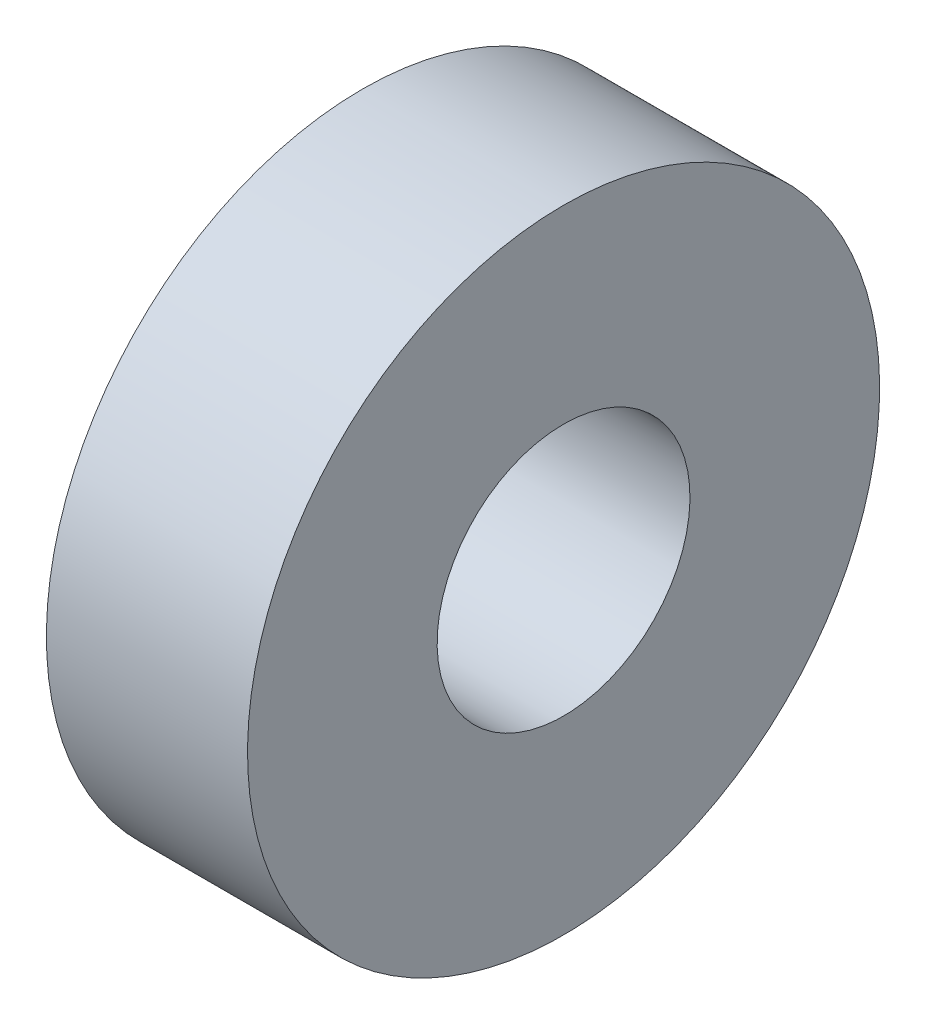
ISO-10303-21;
HEADER;
FILE_DESCRIPTION(('STEP AP214'),'2;1');
FILE_NAME('part.step','',(''),(''),'','','');
FILE_SCHEMA(('AUTOMOTIVE_DESIGN { 1 0 10303 214 1 1 1 1 }'));
ENDSEC;
DATA;
#1=APPLICATION_CONTEXT('core data for automotive mechanical design processes');
#2=APPLICATION_PROTOCOL_DEFINITION('international standard','automotive_design',2000,#1);
#3=PRODUCT_CONTEXT('',#1,'mechanical');
#4=PRODUCT('Part','Part','',(#3));
#5=PRODUCT_RELATED_PRODUCT_CATEGORY('part','',(#4));
#6=PRODUCT_DEFINITION_FORMATION('','',#4);
#7=PRODUCT_DEFINITION_CONTEXT('part definition',#1,'design');
#8=PRODUCT_DEFINITION('design','',#6,#7);
#9=PRODUCT_DEFINITION_SHAPE('','',#8);
#10=(LENGTH_UNIT() NAMED_UNIT(*) SI_UNIT(.MILLI.,.METRE.));
#11=(NAMED_UNIT(*) PLANE_ANGLE_UNIT() SI_UNIT($,.RADIAN.));
#12=(NAMED_UNIT(*) SI_UNIT($,.STERADIAN.) SOLID_ANGLE_UNIT());
#13=UNCERTAINTY_MEASURE_WITH_UNIT(LENGTH_MEASURE(1.E-05),#10,'distance_accuracy_value','');
#14=(GEOMETRIC_REPRESENTATION_CONTEXT(3) GLOBAL_UNCERTAINTY_ASSIGNED_CONTEXT((#13)) GLOBAL_UNIT_ASSIGNED_CONTEXT((#10,
#11,#12)) REPRESENTATION_CONTEXT('',''));
#15=CARTESIAN_POINT('',(0.,0.,0.));
#16=DIRECTION('',(0.,0.,1.));
#17=DIRECTION('',(1.,0.,0.));
#18=AXIS2_PLACEMENT_3D('',#15,#16,#17);
#19=CARTESIAN_POINT('',(0.,0.,0.));
#20=DIRECTION('',(-1.,0.,0.));
#21=DIRECTION('',(0.,0.,1.));
#22=AXIS2_PLACEMENT_3D('',#19,#20,#21);
#23=CYLINDRICAL_SURFACE('',#22,220.);
#24=CARTESIAN_POINT('',(900.,0.,0.));
#25=DIRECTION('',(-1.,0.,0.));
#26=DIRECTION('',(0.,0.,1.));
#27=AXIS2_PLACEMENT_3D('',#24,#25,#26);
#28=CIRCLE('',#27,220.);
#29=CARTESIAN_POINT('',(900.,220.,-1.57950893313031E-06));
#30=VERTEX_POINT('',#29);
#31=CARTESIAN_POINT('',(900.,220.,0.));
#32=VERTEX_POINT('',#31);
#33=EDGE_CURVE('E11',#30,#32,#28,.T.);
#34=ORIENTED_EDGE('',*,*,#33,.T.);
#35=DIRECTION('',(1.,0.,0.));
#36=VECTOR('',#35,1.);
#37=CARTESIAN_POINT('',(1250.,220.,0.));
#38=LINE('',#37,#36);
#39=CARTESIAN_POINT('',(1250.,220.,0.));
#40=VERTEX_POINT('',#39);
#41=EDGE_CURVE('E100',#32,#40,#38,.T.);
#42=ORIENTED_EDGE('',*,*,#41,.T.);
#43=CARTESIAN_POINT('',(1250.,0.,0.));
#44=DIRECTION('',(-1.,0.,0.));
#45=DIRECTION('',(0.,0.,1.));
#46=AXIS2_PLACEMENT_3D('',#43,#44,#45);
#47=CIRCLE('',#46,220.);
#48=CARTESIAN_POINT('',(1250.,220.,-1.57950893313031E-06));
#49=VERTEX_POINT('',#48);
#50=EDGE_CURVE('E80',#49,#40,#47,.T.);
#51=ORIENTED_EDGE('',*,*,#50,.F.);
#52=DIRECTION('',(1.,0.,0.));
#53=VECTOR('',#52,1.);
#54=CARTESIAN_POINT('',(1250.,220.,-1.57950893313031E-06));
#55=LINE('',#54,#53);
#56=EDGE_CURVE('E103',#30,#49,#55,.T.);
#57=ORIENTED_EDGE('',*,*,#56,.F.);
#58=EDGE_LOOP('',(#34,#42,#51,#57));
#59=FACE_BOUND('',#58,.T.);
#60=ADVANCED_FACE('F39',(#59),#23,.F.);
#61=CARTESIAN_POINT('',(900.,220.,-1.57950893313031E-06));
#62=DIRECTION('',(1.,0.,0.));
#63=DIRECTION('',(0.,0.,-1.));
#64=AXIS2_PLACEMENT_3D('',#61,#62,#63);
#65=PLANE('',#64);
#66=CARTESIAN_POINT('',(900.,0.,0.));
#67=DIRECTION('',(-1.,0.,0.));
#68=DIRECTION('',(0.,0.,1.));
#69=AXIS2_PLACEMENT_3D('',#66,#67,#68);
#70=CIRCLE('',#69,550.);
#71=CARTESIAN_POINT('',(900.,550.,-3.94877233282577E-06));
#72=VERTEX_POINT('',#71);
#73=CARTESIAN_POINT('',(900.,550.,0.));
#74=VERTEX_POINT('',#73);
#75=EDGE_CURVE('E50',#72,#74,#70,.T.);
#76=ORIENTED_EDGE('',*,*,#75,.T.);
#77=DIRECTION('',(0.,-1.,0.));
#78=VECTOR('',#77,1.);
#79=CARTESIAN_POINT('',(900.,220.,0.));
#80=LINE('',#79,#78);
#81=EDGE_CURVE('E104',#74,#32,#80,.T.);
#82=ORIENTED_EDGE('',*,*,#81,.T.);
#83=ORIENTED_EDGE('',*,*,#33,.F.);
#84=DIRECTION('',(0.,-1.,7.17958605968322E-09));
#85=VECTOR('',#84,1.);
#86=CARTESIAN_POINT('',(900.,220.,-1.57950893313031E-06));
#87=LINE('',#86,#85);
#88=EDGE_CURVE('E91',#72,#30,#87,.T.);
#89=ORIENTED_EDGE('',*,*,#88,.F.);
#90=EDGE_LOOP('',(#76,#82,#83,#89));
#91=FACE_BOUND('',#90,.T.);
#92=ADVANCED_FACE('F41',(#91),#65,.F.);
#93=CARTESIAN_POINT('',(0.,0.,0.));
#94=DIRECTION('',(-1.,0.,0.));
#95=DIRECTION('',(0.,0.,1.));
#96=AXIS2_PLACEMENT_3D('',#93,#94,#95);
#97=CYLINDRICAL_SURFACE('',#96,550.);
#98=CARTESIAN_POINT('',(1250.,0.,0.));
#99=DIRECTION('',(-1.,0.,0.));
#100=DIRECTION('',(0.,0.,1.));
#101=AXIS2_PLACEMENT_3D('',#98,#99,#100);
#102=CIRCLE('',#101,550.);
#103=CARTESIAN_POINT('',(1250.,550.,-3.94877233282577E-06));
#104=VERTEX_POINT('',#103);
#105=CARTESIAN_POINT('',(1250.,550.,0.));
#106=VERTEX_POINT('',#105);
#107=EDGE_CURVE('E89',#104,#106,#102,.T.);
#108=ORIENTED_EDGE('',*,*,#107,.T.);
#109=DIRECTION('',(-1.,0.,0.));
#110=VECTOR('',#109,1.);
#111=CARTESIAN_POINT('',(900.,550.,0.));
#112=LINE('',#111,#110);
#113=EDGE_CURVE('E97',#106,#74,#112,.T.);
#114=ORIENTED_EDGE('',*,*,#113,.T.);
#115=ORIENTED_EDGE('',*,*,#75,.F.);
#116=DIRECTION('',(-1.,0.,0.));
#117=VECTOR('',#116,1.);
#118=CARTESIAN_POINT('',(900.,550.,-3.94877233282577E-06));
#119=LINE('',#118,#117);
#120=EDGE_CURVE('E109',#104,#72,#119,.T.);
#121=ORIENTED_EDGE('',*,*,#120,.F.);
#122=EDGE_LOOP('',(#108,#114,#115,#121));
#123=FACE_BOUND('',#122,.T.);
#124=ADVANCED_FACE('F112',(#123),#97,.T.);
#125=CARTESIAN_POINT('',(1250.,550.,-3.94877233282577E-06));
#126=DIRECTION('',(-1.,0.,0.));
#127=DIRECTION('',(0.,0.,1.));
#128=AXIS2_PLACEMENT_3D('',#125,#126,#127);
#129=PLANE('',#128);
#130=DIRECTION('',(0.,1.,-7.17958605968322E-09));
#131=VECTOR('',#130,1.);
#132=CARTESIAN_POINT('',(1250.,550.,-3.94877233282577E-06));
#133=LINE('',#132,#131);
#134=EDGE_CURVE('E82',#49,#104,#133,.T.);
#135=ORIENTED_EDGE('',*,*,#134,.F.);
#136=ORIENTED_EDGE('',*,*,#50,.T.);
#137=DIRECTION('',(0.,1.,0.));
#138=VECTOR('',#137,1.);
#139=CARTESIAN_POINT('',(1250.,550.,0.));
#140=LINE('',#139,#138);
#141=EDGE_CURVE('E85',#40,#106,#140,.T.);
#142=ORIENTED_EDGE('',*,*,#141,.T.);
#143=ORIENTED_EDGE('',*,*,#107,.F.);
#144=EDGE_LOOP('',(#135,#136,#142,#143));
#145=FACE_BOUND('',#144,.T.);
#146=ADVANCED_FACE('F83',(#145),#129,.F.);
#147=CARTESIAN_POINT('',(0.,0.,0.));
#148=DIRECTION('',(0.,-7.17958605968322E-09,-1.));
#149=DIRECTION('',(-1.,0.,0.));
#150=AXIS2_PLACEMENT_3D('',#147,#148,#149);
#151=PLANE('',#150);
#152=ORIENTED_EDGE('',*,*,#56,.T.);
#153=ORIENTED_EDGE('',*,*,#134,.T.);
#154=ORIENTED_EDGE('',*,*,#120,.T.);
#155=ORIENTED_EDGE('',*,*,#88,.T.);
#156=EDGE_LOOP('',(#152,#153,#154,#155));
#157=FACE_BOUND('',#156,.T.);
#158=ADVANCED_FACE('F111',(#157),#151,.F.);
#159=CARTESIAN_POINT('',(0.,0.,0.));
#160=DIRECTION('',(0.,0.,-1.));
#161=DIRECTION('',(-1.,0.,0.));
#162=AXIS2_PLACEMENT_3D('',#159,#160,#161);
#163=PLANE('',#162);
#164=ORIENTED_EDGE('',*,*,#41,.F.);
#165=ORIENTED_EDGE('',*,*,#81,.F.);
#166=ORIENTED_EDGE('',*,*,#113,.F.);
#167=ORIENTED_EDGE('',*,*,#141,.F.);
#168=EDGE_LOOP('',(#164,#165,#166,#167));
#169=FACE_BOUND('',#168,.T.);
#170=ADVANCED_FACE('F94',(#169),#163,.T.);
#171=CLOSED_SHELL('',(#60,#92,#124,#146,#158,#170));
#172=MANIFOLD_SOLID_BREP('B2',#171);
#173=ADVANCED_BREP_SHAPE_REPRESENTATION('',(#18,#172),#14);
#174=SHAPE_DEFINITION_REPRESENTATION(#9,#173);
ENDSEC;
END-ISO-10303-21;
